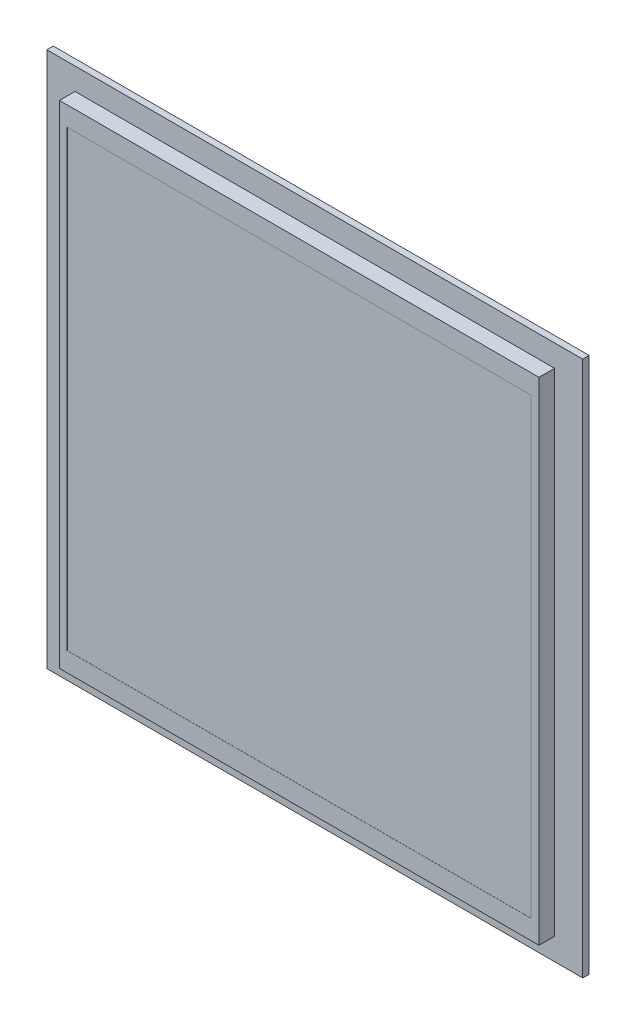
ISO-10303-21;
HEADER;
FILE_DESCRIPTION(('STEP AP214'),'2;1');
FILE_NAME('part.step','',(''),(''),'','','');
FILE_SCHEMA(('AUTOMOTIVE_DESIGN { 1 0 10303 214 1 1 1 1 }'));
ENDSEC;
DATA;
#1=APPLICATION_CONTEXT('core data for automotive mechanical design processes');
#2=APPLICATION_PROTOCOL_DEFINITION('international standard','automotive_design',2000,#1);
#3=PRODUCT_CONTEXT('',#1,'mechanical');
#4=PRODUCT('Part','Part','',(#3));
#5=PRODUCT_RELATED_PRODUCT_CATEGORY('part','',(#4));
#6=PRODUCT_DEFINITION_FORMATION('','',#4);
#7=PRODUCT_DEFINITION_CONTEXT('part definition',#1,'design');
#8=PRODUCT_DEFINITION('design','',#6,#7);
#9=PRODUCT_DEFINITION_SHAPE('','',#8);
#10=(LENGTH_UNIT() NAMED_UNIT(*) SI_UNIT(.MILLI.,.METRE.));
#11=(NAMED_UNIT(*) PLANE_ANGLE_UNIT() SI_UNIT($,.RADIAN.));
#12=(NAMED_UNIT(*) SI_UNIT($,.STERADIAN.) SOLID_ANGLE_UNIT());
#13=UNCERTAINTY_MEASURE_WITH_UNIT(LENGTH_MEASURE(1.E-05),#10,'distance_accuracy_value','');
#14=(GEOMETRIC_REPRESENTATION_CONTEXT(3) GLOBAL_UNCERTAINTY_ASSIGNED_CONTEXT((#13)) GLOBAL_UNIT_ASSIGNED_CONTEXT((#10,
#11,#12)) REPRESENTATION_CONTEXT('',''));
#15=CARTESIAN_POINT('',(0.,0.,0.));
#16=DIRECTION('',(0.,0.,1.));
#17=DIRECTION('',(1.,0.,0.));
#18=AXIS2_PLACEMENT_3D('',#15,#16,#17);
#19=CARTESIAN_POINT('',(-41.5,0.,1.));
#20=DIRECTION('',(-1.,0.,0.));
#21=DIRECTION('',(0.,0.,1.));
#22=AXIS2_PLACEMENT_3D('',#19,#20,#21);
#23=PLANE('',#22);
#24=DIRECTION('',(0.,1.,0.));
#25=VECTOR('',#24,1.);
#26=CARTESIAN_POINT('',(-41.5,0.,0.));
#27=LINE('',#26,#25);
#28=CARTESIAN_POINT('',(-41.5,-41.5,0.));
#29=VERTEX_POINT('',#28);
#30=CARTESIAN_POINT('',(-41.5,41.5,0.));
#31=VERTEX_POINT('',#30);
#32=EDGE_CURVE('E197',#29,#31,#27,.T.);
#33=ORIENTED_EDGE('',*,*,#32,.F.);
#34=DIRECTION('',(0.,0.,-1.));
#35=VECTOR('',#34,1.);
#36=CARTESIAN_POINT('',(-41.5,-41.5,1.));
#37=LINE('',#36,#35);
#38=CARTESIAN_POINT('',(-41.5,-41.5,1.));
#39=VERTEX_POINT('',#38);
#40=EDGE_CURVE('E11',#39,#29,#37,.T.);
#41=ORIENTED_EDGE('',*,*,#40,.F.);
#42=DIRECTION('',(0.,1.,0.));
#43=VECTOR('',#42,1.);
#44=CARTESIAN_POINT('',(-41.5,0.,1.));
#45=LINE('',#44,#43);
#46=CARTESIAN_POINT('',(-41.5,41.5,1.));
#47=VERTEX_POINT('',#46);
#48=EDGE_CURVE('E198',#39,#47,#45,.T.);
#49=ORIENTED_EDGE('',*,*,#48,.T.);
#50=DIRECTION('',(0.,0.,-1.));
#51=VECTOR('',#50,1.);
#52=CARTESIAN_POINT('',(-41.5,41.5,1.));
#53=LINE('',#52,#51);
#54=EDGE_CURVE('E209',#47,#31,#53,.T.);
#55=ORIENTED_EDGE('',*,*,#54,.T.);
#56=EDGE_LOOP('',(#33,#41,#49,#55));
#57=FACE_BOUND('',#56,.T.);
#58=ADVANCED_FACE('F38',(#57),#23,.T.);
#59=CARTESIAN_POINT('',(0.,-41.5,1.));
#60=DIRECTION('',(0.,1.,0.));
#61=DIRECTION('',(0.,0.,1.));
#62=AXIS2_PLACEMENT_3D('',#59,#60,#61);
#63=PLANE('',#62);
#64=DIRECTION('',(1.,0.,0.));
#65=VECTOR('',#64,1.);
#66=CARTESIAN_POINT('',(0.,-41.5,0.));
#67=LINE('',#66,#65);
#68=CARTESIAN_POINT('',(41.5,-41.5,0.));
#69=VERTEX_POINT('',#68);
#70=EDGE_CURVE('E212',#29,#69,#67,.T.);
#71=ORIENTED_EDGE('',*,*,#70,.T.);
#72=DIRECTION('',(0.,0.,-1.));
#73=VECTOR('',#72,1.);
#74=CARTESIAN_POINT('',(41.5,-41.5,1.));
#75=LINE('',#74,#73);
#76=CARTESIAN_POINT('',(41.5,-41.5,1.));
#77=VERTEX_POINT('',#76);
#78=EDGE_CURVE('E45',#77,#69,#75,.T.);
#79=ORIENTED_EDGE('',*,*,#78,.F.);
#80=DIRECTION('',(1.,0.,0.));
#81=VECTOR('',#80,1.);
#82=CARTESIAN_POINT('',(0.,-41.5,1.));
#83=LINE('',#82,#81);
#84=EDGE_CURVE('E201',#39,#77,#83,.T.);
#85=ORIENTED_EDGE('',*,*,#84,.F.);
#86=ORIENTED_EDGE('',*,*,#40,.T.);
#87=EDGE_LOOP('',(#71,#79,#85,#86));
#88=FACE_BOUND('',#87,.T.);
#89=ADVANCED_FACE('F241',(#88),#63,.F.);
#90=CARTESIAN_POINT('',(41.5,0.,1.));
#91=DIRECTION('',(-1.,0.,0.));
#92=DIRECTION('',(0.,0.,1.));
#93=AXIS2_PLACEMENT_3D('',#90,#91,#92);
#94=PLANE('',#93);
#95=DIRECTION('',(0.,1.,0.));
#96=VECTOR('',#95,1.);
#97=CARTESIAN_POINT('',(41.5,0.,0.));
#98=LINE('',#97,#96);
#99=CARTESIAN_POINT('',(41.5,41.5,0.));
#100=VERTEX_POINT('',#99);
#101=EDGE_CURVE('E214',#69,#100,#98,.T.);
#102=ORIENTED_EDGE('',*,*,#101,.T.);
#103=DIRECTION('',(0.,0.,-1.));
#104=VECTOR('',#103,1.);
#105=CARTESIAN_POINT('',(41.5,41.5,1.));
#106=LINE('',#105,#104);
#107=CARTESIAN_POINT('',(41.5,41.5,1.));
#108=VERTEX_POINT('',#107);
#109=EDGE_CURVE('E220',#108,#100,#106,.T.);
#110=ORIENTED_EDGE('',*,*,#109,.F.);
#111=DIRECTION('',(0.,1.,0.));
#112=VECTOR('',#111,1.);
#113=CARTESIAN_POINT('',(41.5,0.,1.));
#114=LINE('',#113,#112);
#115=EDGE_CURVE('E204',#77,#108,#114,.T.);
#116=ORIENTED_EDGE('',*,*,#115,.F.);
#117=ORIENTED_EDGE('',*,*,#78,.T.);
#118=EDGE_LOOP('',(#102,#110,#116,#117));
#119=FACE_BOUND('',#118,.T.);
#120=ADVANCED_FACE('F226',(#119),#94,.F.);
#121=CARTESIAN_POINT('',(0.,41.5,1.));
#122=DIRECTION('',(0.,1.,0.));
#123=DIRECTION('',(0.,0.,1.));
#124=AXIS2_PLACEMENT_3D('',#121,#122,#123);
#125=PLANE('',#124);
#126=DIRECTION('',(1.,0.,0.));
#127=VECTOR('',#126,1.);
#128=CARTESIAN_POINT('',(0.,41.5,0.));
#129=LINE('',#128,#127);
#130=EDGE_CURVE('E202',#31,#100,#129,.T.);
#131=ORIENTED_EDGE('',*,*,#130,.F.);
#132=ORIENTED_EDGE('',*,*,#54,.F.);
#133=DIRECTION('',(1.,0.,0.));
#134=VECTOR('',#133,1.);
#135=CARTESIAN_POINT('',(0.,41.5,1.));
#136=LINE('',#135,#134);
#137=EDGE_CURVE('E206',#47,#108,#136,.T.);
#138=ORIENTED_EDGE('',*,*,#137,.T.);
#139=ORIENTED_EDGE('',*,*,#109,.T.);
#140=EDGE_LOOP('',(#131,#132,#138,#139));
#141=FACE_BOUND('',#140,.T.);
#142=ADVANCED_FACE('F236',(#141),#125,.T.);
#143=CARTESIAN_POINT('',(0.,0.,1.));
#144=DIRECTION('',(0.,0.,1.));
#145=DIRECTION('',(1.,0.,0.));
#146=AXIS2_PLACEMENT_3D('',#143,#144,#145);
#147=PLANE('',#146);
#148=DIRECTION('',(0.,-1.,0.));
#149=VECTOR('',#148,1.);
#150=CARTESIAN_POINT('',(-37.13,0.,1.));
#151=LINE('',#150,#149);
#152=CARTESIAN_POINT('',(-37.13,38.09,1.));
#153=VERTEX_POINT('',#152);
#154=CARTESIAN_POINT('',(-37.13,-38.09,1.));
#155=VERTEX_POINT('',#154);
#156=EDGE_CURVE('E186',#153,#155,#151,.T.);
#157=ORIENTED_EDGE('',*,*,#156,.F.);
#158=DIRECTION('',(-1.,0.,0.));
#159=VECTOR('',#158,1.);
#160=CARTESIAN_POINT('',(0.,38.09,1.));
#161=LINE('',#160,#159);
#162=CARTESIAN_POINT('',(37.13,38.09,1.));
#163=VERTEX_POINT('',#162);
#164=EDGE_CURVE('E176',#163,#153,#161,.T.);
#165=ORIENTED_EDGE('',*,*,#164,.F.);
#166=DIRECTION('',(0.,-1.,0.));
#167=VECTOR('',#166,1.);
#168=CARTESIAN_POINT('',(37.13,0.,1.));
#169=LINE('',#168,#167);
#170=CARTESIAN_POINT('',(37.13,-38.09,1.));
#171=VERTEX_POINT('',#170);
#172=EDGE_CURVE('E57',#163,#171,#169,.T.);
#173=ORIENTED_EDGE('',*,*,#172,.T.);
#174=DIRECTION('',(-1.,0.,0.));
#175=VECTOR('',#174,1.);
#176=CARTESIAN_POINT('',(0.,-38.09,1.));
#177=LINE('',#176,#175);
#178=EDGE_CURVE('E52',#171,#155,#177,.T.);
#179=ORIENTED_EDGE('',*,*,#178,.T.);
#180=EDGE_LOOP('',(#157,#165,#173,#179));
#181=FACE_BOUND('',#180,.T.);
#182=ORIENTED_EDGE('',*,*,#48,.F.);
#183=ORIENTED_EDGE('',*,*,#84,.T.);
#184=ORIENTED_EDGE('',*,*,#115,.T.);
#185=ORIENTED_EDGE('',*,*,#137,.F.);
#186=EDGE_LOOP('',(#182,#183,#184,#185));
#187=FACE_BOUND('',#186,.T.);
#188=ADVANCED_FACE('F240',(#181,#187),#147,.T.);
#189=CARTESIAN_POINT('',(0.,0.,0.));
#190=DIRECTION('',(0.,0.,1.));
#191=DIRECTION('',(1.,0.,0.));
#192=AXIS2_PLACEMENT_3D('',#189,#190,#191);
#193=PLANE('',#192);
#194=ORIENTED_EDGE('',*,*,#32,.T.);
#195=ORIENTED_EDGE('',*,*,#130,.T.);
#196=ORIENTED_EDGE('',*,*,#101,.F.);
#197=ORIENTED_EDGE('',*,*,#70,.F.);
#198=EDGE_LOOP('',(#194,#195,#196,#197));
#199=FACE_BOUND('',#198,.T.);
#200=ADVANCED_FACE('F232',(#199),#193,.F.);
#201=CARTESIAN_POINT('',(35.928,0.,3.41));
#202=DIRECTION('',(-1.,0.,0.));
#203=DIRECTION('',(0.,0.,1.));
#204=AXIS2_PLACEMENT_3D('',#201,#202,#203);
#205=PLANE('',#204);
#206=DIRECTION('',(0.,1.,0.));
#207=VECTOR('',#206,1.);
#208=CARTESIAN_POINT('',(35.928,-35.088,3.4));
#209=LINE('',#208,#207);
#210=CARTESIAN_POINT('',(35.928,-35.088,3.4));
#211=VERTEX_POINT('',#210);
#212=CARTESIAN_POINT('',(35.928,35.088,3.4));
#213=VERTEX_POINT('',#212);
#214=EDGE_CURVE('E129',#211,#213,#209,.T.);
#215=ORIENTED_EDGE('',*,*,#214,.F.);
#216=DIRECTION('',(0.,0.,-1.));
#217=VECTOR('',#216,1.);
#218=CARTESIAN_POINT('',(35.928,-35.088,3.41));
#219=LINE('',#218,#217);
#220=CARTESIAN_POINT('',(35.928,-35.088,3.41));
#221=VERTEX_POINT('',#220);
#222=EDGE_CURVE('E124',#221,#211,#219,.T.);
#223=ORIENTED_EDGE('',*,*,#222,.F.);
#224=DIRECTION('',(0.,1.,0.));
#225=VECTOR('',#224,1.);
#226=CARTESIAN_POINT('',(35.928,0.,3.41));
#227=LINE('',#226,#225);
#228=CARTESIAN_POINT('',(35.928,35.088,3.41));
#229=VERTEX_POINT('',#228);
#230=EDGE_CURVE('E128',#221,#229,#227,.T.);
#231=ORIENTED_EDGE('',*,*,#230,.T.);
#232=DIRECTION('',(0.,0.,-1.));
#233=VECTOR('',#232,1.);
#234=CARTESIAN_POINT('',(35.928,35.088,3.41));
#235=LINE('',#234,#233);
#236=EDGE_CURVE('E164',#229,#213,#235,.T.);
#237=ORIENTED_EDGE('',*,*,#236,.T.);
#238=EDGE_LOOP('',(#215,#223,#231,#237));
#239=FACE_BOUND('',#238,.T.);
#240=ADVANCED_FACE('F126',(#239),#205,.T.);
#241=CARTESIAN_POINT('',(0.,-35.088,3.41));
#242=DIRECTION('',(0.,1.,0.));
#243=DIRECTION('',(0.,0.,1.));
#244=AXIS2_PLACEMENT_3D('',#241,#242,#243);
#245=PLANE('',#244);
#246=DIRECTION('',(1.,0.,0.));
#247=VECTOR('',#246,1.);
#248=CARTESIAN_POINT('',(-35.928,-35.088,3.4));
#249=LINE('',#248,#247);
#250=CARTESIAN_POINT('',(-35.928,-35.088,3.4));
#251=VERTEX_POINT('',#250);
#252=EDGE_CURVE('E195',#251,#211,#249,.T.);
#253=ORIENTED_EDGE('',*,*,#252,.F.);
#254=DIRECTION('',(0.,0.,-1.));
#255=VECTOR('',#254,1.);
#256=CARTESIAN_POINT('',(-35.928,-35.088,3.41));
#257=LINE('',#256,#255);
#258=CARTESIAN_POINT('',(-35.928,-35.088,3.41));
#259=VERTEX_POINT('',#258);
#260=EDGE_CURVE('E134',#259,#251,#257,.T.);
#261=ORIENTED_EDGE('',*,*,#260,.F.);
#262=DIRECTION('',(1.,0.,0.));
#263=VECTOR('',#262,1.);
#264=CARTESIAN_POINT('',(0.,-35.088,3.41));
#265=LINE('',#264,#263);
#266=EDGE_CURVE('E140',#259,#221,#265,.T.);
#267=ORIENTED_EDGE('',*,*,#266,.T.);
#268=ORIENTED_EDGE('',*,*,#222,.T.);
#269=EDGE_LOOP('',(#253,#261,#267,#268));
#270=FACE_BOUND('',#269,.T.);
#271=ADVANCED_FACE('F145',(#270),#245,.T.);
#272=CARTESIAN_POINT('',(-35.928,0.,3.41));
#273=DIRECTION('',(-1.,0.,0.));
#274=DIRECTION('',(0.,0.,1.));
#275=AXIS2_PLACEMENT_3D('',#272,#273,#274);
#276=PLANE('',#275);
#277=ORIENTED_EDGE('',*,*,#260,.T.);
#278=DIRECTION('',(0.,1.,0.));
#279=VECTOR('',#278,1.);
#280=CARTESIAN_POINT('',(-35.928,-35.088,3.4));
#281=LINE('',#280,#279);
#282=CARTESIAN_POINT('',(-35.928,35.088,3.4));
#283=VERTEX_POINT('',#282);
#284=EDGE_CURVE('E188',#251,#283,#281,.T.);
#285=ORIENTED_EDGE('',*,*,#284,.T.);
#286=DIRECTION('',(0.,0.,-1.));
#287=VECTOR('',#286,1.);
#288=CARTESIAN_POINT('',(-35.928,35.088,3.41));
#289=LINE('',#288,#287);
#290=CARTESIAN_POINT('',(-35.928,35.088,3.41));
#291=VERTEX_POINT('',#290);
#292=EDGE_CURVE('E178',#291,#283,#289,.T.);
#293=ORIENTED_EDGE('',*,*,#292,.F.);
#294=DIRECTION('',(0.,1.,0.));
#295=VECTOR('',#294,1.);
#296=CARTESIAN_POINT('',(-35.928,0.,3.41));
#297=LINE('',#296,#295);
#298=EDGE_CURVE('E148',#259,#291,#297,.T.);
#299=ORIENTED_EDGE('',*,*,#298,.F.);
#300=EDGE_LOOP('',(#277,#285,#293,#299));
#301=FACE_BOUND('',#300,.T.);
#302=ADVANCED_FACE('F266',(#301),#276,.F.);
#303=CARTESIAN_POINT('',(0.,35.088,3.41));
#304=DIRECTION('',(0.,1.,0.));
#305=DIRECTION('',(0.,0.,1.));
#306=AXIS2_PLACEMENT_3D('',#303,#304,#305);
#307=PLANE('',#306);
#308=ORIENTED_EDGE('',*,*,#292,.T.);
#309=DIRECTION('',(1.,0.,0.));
#310=VECTOR('',#309,1.);
#311=CARTESIAN_POINT('',(-35.928,35.088,3.4));
#312=LINE('',#311,#310);
#313=EDGE_CURVE('E191',#283,#213,#312,.T.);
#314=ORIENTED_EDGE('',*,*,#313,.T.);
#315=ORIENTED_EDGE('',*,*,#236,.F.);
#316=DIRECTION('',(1.,0.,0.));
#317=VECTOR('',#316,1.);
#318=CARTESIAN_POINT('',(0.,35.088,3.41));
#319=LINE('',#318,#317);
#320=EDGE_CURVE('E142',#291,#229,#319,.T.);
#321=ORIENTED_EDGE('',*,*,#320,.F.);
#322=EDGE_LOOP('',(#308,#314,#315,#321));
#323=FACE_BOUND('',#322,.T.);
#324=ADVANCED_FACE('F269',(#323),#307,.F.);
#325=CARTESIAN_POINT('',(-37.13,0.,3.41));
#326=DIRECTION('',(-1.,0.,0.));
#327=DIRECTION('',(0.,0.,1.));
#328=AXIS2_PLACEMENT_3D('',#325,#326,#327);
#329=PLANE('',#328);
#330=DIRECTION('',(0.,0.,-1.));
#331=VECTOR('',#330,1.);
#332=CARTESIAN_POINT('',(-37.13,38.09,3.41));
#333=LINE('',#332,#331);
#334=CARTESIAN_POINT('',(-37.13,38.09,3.41));
#335=VERTEX_POINT('',#334);
#336=EDGE_CURVE('E133',#335,#153,#333,.T.);
#337=ORIENTED_EDGE('',*,*,#336,.T.);
#338=ORIENTED_EDGE('',*,*,#156,.T.);
#339=DIRECTION('',(0.,0.,-1.));
#340=VECTOR('',#339,1.);
#341=CARTESIAN_POINT('',(-37.13,-38.09,3.41));
#342=LINE('',#341,#340);
#343=CARTESIAN_POINT('',(-37.13,-38.09,3.41));
#344=VERTEX_POINT('',#343);
#345=EDGE_CURVE('E173',#344,#155,#342,.T.);
#346=ORIENTED_EDGE('',*,*,#345,.F.);
#347=DIRECTION('',(0.,1.,0.));
#348=VECTOR('',#347,1.);
#349=CARTESIAN_POINT('',(-37.13,0.,3.41));
#350=LINE('',#349,#348);
#351=EDGE_CURVE('E153',#344,#335,#350,.T.);
#352=ORIENTED_EDGE('',*,*,#351,.T.);
#353=EDGE_LOOP('',(#337,#338,#346,#352));
#354=FACE_BOUND('',#353,.T.);
#355=ADVANCED_FACE('F273',(#354),#329,.T.);
#356=CARTESIAN_POINT('',(0.,-38.09,3.41));
#357=DIRECTION('',(0.,1.,0.));
#358=DIRECTION('',(0.,0.,1.));
#359=AXIS2_PLACEMENT_3D('',#356,#357,#358);
#360=PLANE('',#359);
#361=ORIENTED_EDGE('',*,*,#178,.F.);
#362=DIRECTION('',(0.,0.,-1.));
#363=VECTOR('',#362,1.);
#364=CARTESIAN_POINT('',(37.13,-38.09,3.41));
#365=LINE('',#364,#363);
#366=CARTESIAN_POINT('',(37.13,-38.09,3.41));
#367=VERTEX_POINT('',#366);
#368=EDGE_CURVE('E170',#367,#171,#365,.T.);
#369=ORIENTED_EDGE('',*,*,#368,.F.);
#370=DIRECTION('',(1.,0.,0.));
#371=VECTOR('',#370,1.);
#372=CARTESIAN_POINT('',(0.,-38.09,3.41));
#373=LINE('',#372,#371);
#374=EDGE_CURVE('E156',#344,#367,#373,.T.);
#375=ORIENTED_EDGE('',*,*,#374,.F.);
#376=ORIENTED_EDGE('',*,*,#345,.T.);
#377=EDGE_LOOP('',(#361,#369,#375,#376));
#378=FACE_BOUND('',#377,.T.);
#379=ADVANCED_FACE('F277',(#378),#360,.F.);
#380=CARTESIAN_POINT('',(37.13,0.,3.41));
#381=DIRECTION('',(-1.,0.,0.));
#382=DIRECTION('',(0.,0.,1.));
#383=AXIS2_PLACEMENT_3D('',#380,#381,#382);
#384=PLANE('',#383);
#385=ORIENTED_EDGE('',*,*,#172,.F.);
#386=DIRECTION('',(0.,0.,-1.));
#387=VECTOR('',#386,1.);
#388=CARTESIAN_POINT('',(37.13,38.09,3.41));
#389=LINE('',#388,#387);
#390=CARTESIAN_POINT('',(37.13,38.09,3.41));
#391=VERTEX_POINT('',#390);
#392=EDGE_CURVE('E167',#391,#163,#389,.T.);
#393=ORIENTED_EDGE('',*,*,#392,.F.);
#394=DIRECTION('',(0.,1.,0.));
#395=VECTOR('',#394,1.);
#396=CARTESIAN_POINT('',(37.13,0.,3.41));
#397=LINE('',#396,#395);
#398=EDGE_CURVE('E159',#367,#391,#397,.T.);
#399=ORIENTED_EDGE('',*,*,#398,.F.);
#400=ORIENTED_EDGE('',*,*,#368,.T.);
#401=EDGE_LOOP('',(#385,#393,#399,#400));
#402=FACE_BOUND('',#401,.T.);
#403=ADVANCED_FACE('F281',(#402),#384,.F.);
#404=CARTESIAN_POINT('',(0.,38.09,3.41));
#405=DIRECTION('',(0.,1.,0.));
#406=DIRECTION('',(0.,0.,1.));
#407=AXIS2_PLACEMENT_3D('',#404,#405,#406);
#408=PLANE('',#407);
#409=ORIENTED_EDGE('',*,*,#392,.T.);
#410=ORIENTED_EDGE('',*,*,#164,.T.);
#411=ORIENTED_EDGE('',*,*,#336,.F.);
#412=DIRECTION('',(1.,0.,0.));
#413=VECTOR('',#412,1.);
#414=CARTESIAN_POINT('',(0.,38.09,3.41));
#415=LINE('',#414,#413);
#416=EDGE_CURVE('E161',#335,#391,#415,.T.);
#417=ORIENTED_EDGE('',*,*,#416,.T.);
#418=EDGE_LOOP('',(#409,#410,#411,#417));
#419=FACE_BOUND('',#418,.T.);
#420=ADVANCED_FACE('F285',(#419),#408,.T.);
#421=CARTESIAN_POINT('',(0.,0.,3.41));
#422=DIRECTION('',(0.,0.,1.));
#423=DIRECTION('',(1.,0.,0.));
#424=AXIS2_PLACEMENT_3D('',#421,#422,#423);
#425=PLANE('',#424);
#426=ORIENTED_EDGE('',*,*,#230,.F.);
#427=ORIENTED_EDGE('',*,*,#266,.F.);
#428=ORIENTED_EDGE('',*,*,#298,.T.);
#429=ORIENTED_EDGE('',*,*,#320,.T.);
#430=EDGE_LOOP('',(#426,#427,#428,#429));
#431=FACE_BOUND('',#430,.T.);
#432=ORIENTED_EDGE('',*,*,#351,.F.);
#433=ORIENTED_EDGE('',*,*,#374,.T.);
#434=ORIENTED_EDGE('',*,*,#398,.T.);
#435=ORIENTED_EDGE('',*,*,#416,.F.);
#436=EDGE_LOOP('',(#432,#433,#434,#435));
#437=FACE_BOUND('',#436,.T.);
#438=ADVANCED_FACE('F138',(#431,#437),#425,.T.);
#439=CARTESIAN_POINT('',(0.,0.,3.4));
#440=DIRECTION('',(0.,0.,-1.));
#441=DIRECTION('',(-1.,0.,0.));
#442=AXIS2_PLACEMENT_3D('',#439,#440,#441);
#443=PLANE('',#442);
#444=ORIENTED_EDGE('',*,*,#284,.F.);
#445=ORIENTED_EDGE('',*,*,#252,.T.);
#446=ORIENTED_EDGE('',*,*,#214,.T.);
#447=ORIENTED_EDGE('',*,*,#313,.F.);
#448=EDGE_LOOP('',(#444,#445,#446,#447));
#449=FACE_BOUND('',#448,.T.);
#450=ADVANCED_FACE('F258',(#449),#443,.F.);
#451=CLOSED_SHELL('',(#58,#89,#120,#142,#188,#200,#240,#271,#302,#324,#355,#379,#403,#420,#438,#450));
#452=MANIFOLD_SOLID_BREP('B2',#451);
#453=ADVANCED_BREP_SHAPE_REPRESENTATION('',(#18,#452),#14);
#454=SHAPE_DEFINITION_REPRESENTATION(#9,#453);
ENDSEC;
END-ISO-10303-21;
